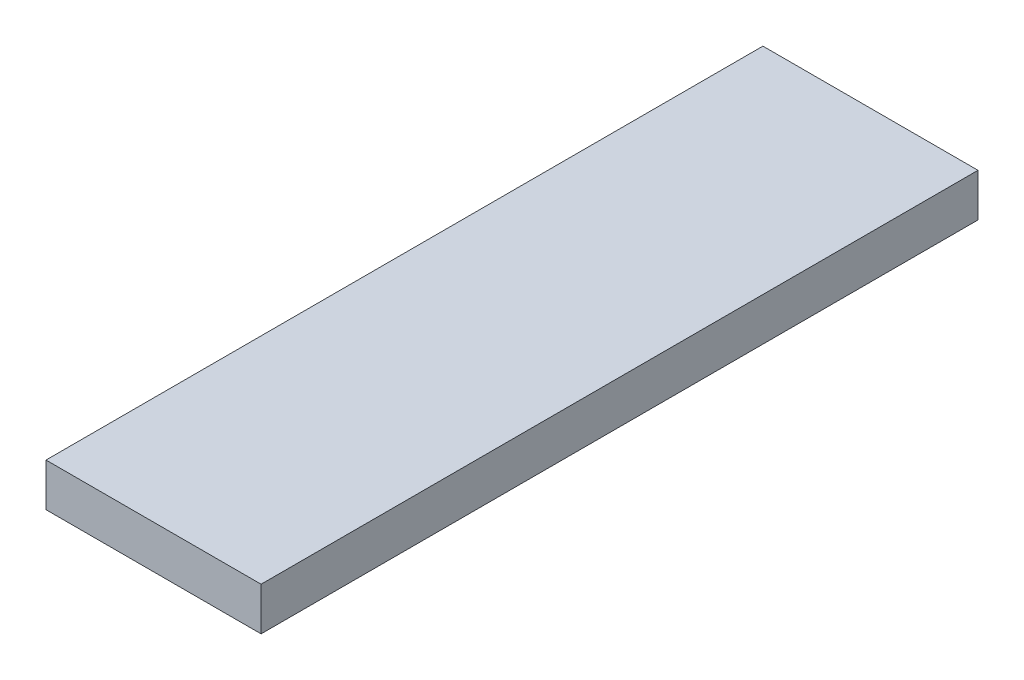
ISO-10303-21;
HEADER;
FILE_DESCRIPTION(('STEP AP214'),'2;1');
FILE_NAME('part.step','',(''),(''),'','','');
FILE_SCHEMA(('AUTOMOTIVE_DESIGN { 1 0 10303 214 1 1 1 1 }'));
ENDSEC;
DATA;
#1=APPLICATION_CONTEXT('core data for automotive mechanical design processes');
#2=APPLICATION_PROTOCOL_DEFINITION('international standard','automotive_design',2000,#1);
#3=PRODUCT_CONTEXT('',#1,'mechanical');
#4=PRODUCT('Part','Part','',(#3));
#5=PRODUCT_RELATED_PRODUCT_CATEGORY('part','',(#4));
#6=PRODUCT_DEFINITION_FORMATION('','',#4);
#7=PRODUCT_DEFINITION_CONTEXT('part definition',#1,'design');
#8=PRODUCT_DEFINITION('design','',#6,#7);
#9=PRODUCT_DEFINITION_SHAPE('','',#8);
#10=(LENGTH_UNIT() NAMED_UNIT(*) SI_UNIT(.MILLI.,.METRE.));
#11=(NAMED_UNIT(*) PLANE_ANGLE_UNIT() SI_UNIT($,.RADIAN.));
#12=(NAMED_UNIT(*) SI_UNIT($,.STERADIAN.) SOLID_ANGLE_UNIT());
#13=UNCERTAINTY_MEASURE_WITH_UNIT(LENGTH_MEASURE(1.E-05),#10,'distance_accuracy_value','');
#14=(GEOMETRIC_REPRESENTATION_CONTEXT(3) GLOBAL_UNCERTAINTY_ASSIGNED_CONTEXT((#13)) GLOBAL_UNIT_ASSIGNED_CONTEXT((#10,
#11,#12)) REPRESENTATION_CONTEXT('',''));
#15=CARTESIAN_POINT('',(0.,0.,0.));
#16=DIRECTION('',(0.,0.,1.));
#17=DIRECTION('',(1.,0.,0.));
#18=AXIS2_PLACEMENT_3D('',#15,#16,#17);
#19=CARTESIAN_POINT('',(0.,0.,635.));
#20=DIRECTION('',(1.,0.,0.));
#21=DIRECTION('',(0.,0.,-1.));
#22=AXIS2_PLACEMENT_3D('',#19,#20,#21);
#23=PLANE('',#22);
#24=DIRECTION('',(0.,-1.,0.));
#25=VECTOR('',#24,1.);
#26=CARTESIAN_POINT('',(0.,0.,0.));
#27=LINE('',#26,#25);
#28=CARTESIAN_POINT('',(0.,38.1,0.));
#29=VERTEX_POINT('',#28);
#30=CARTESIAN_POINT('',(0.,0.,0.));
#31=VERTEX_POINT('',#30);
#32=EDGE_CURVE('E96',#29,#31,#27,.T.);
#33=ORIENTED_EDGE('',*,*,#32,.T.);
#34=DIRECTION('',(0.,0.,-1.));
#35=VECTOR('',#34,1.);
#36=CARTESIAN_POINT('',(0.,0.,635.));
#37=LINE('',#36,#35);
#38=CARTESIAN_POINT('',(0.,0.,635.));
#39=VERTEX_POINT('',#38);
#40=EDGE_CURVE('E11',#39,#31,#37,.T.);
#41=ORIENTED_EDGE('',*,*,#40,.F.);
#42=DIRECTION('',(0.,-1.,0.));
#43=VECTOR('',#42,1.);
#44=CARTESIAN_POINT('',(0.,0.,635.));
#45=LINE('',#44,#43);
#46=CARTESIAN_POINT('',(0.,38.1,635.));
#47=VERTEX_POINT('',#46);
#48=EDGE_CURVE('E84',#47,#39,#45,.T.);
#49=ORIENTED_EDGE('',*,*,#48,.F.);
#50=DIRECTION('',(0.,0.,-1.));
#51=VECTOR('',#50,1.);
#52=CARTESIAN_POINT('',(0.,38.1,635.));
#53=LINE('',#52,#51);
#54=EDGE_CURVE('E92',#47,#29,#53,.T.);
#55=ORIENTED_EDGE('',*,*,#54,.T.);
#56=EDGE_LOOP('',(#33,#41,#49,#55));
#57=FACE_BOUND('',#56,.T.);
#58=ADVANCED_FACE('F33',(#57),#23,.F.);
#59=CARTESIAN_POINT('',(0.,0.,635.));
#60=DIRECTION('',(0.,1.,0.));
#61=DIRECTION('',(0.,0.,1.));
#62=AXIS2_PLACEMENT_3D('',#59,#60,#61);
#63=PLANE('',#62);
#64=DIRECTION('',(1.,0.,0.));
#65=VECTOR('',#64,1.);
#66=CARTESIAN_POINT('',(0.,0.,0.));
#67=LINE('',#66,#65);
#68=CARTESIAN_POINT('',(190.5,0.,0.));
#69=VERTEX_POINT('',#68);
#70=EDGE_CURVE('E88',#31,#69,#67,.T.);
#71=ORIENTED_EDGE('',*,*,#70,.T.);
#72=DIRECTION('',(0.,0.,-1.));
#73=VECTOR('',#72,1.);
#74=CARTESIAN_POINT('',(190.5,0.,635.));
#75=LINE('',#74,#73);
#76=CARTESIAN_POINT('',(190.5,0.,635.));
#77=VERTEX_POINT('',#76);
#78=EDGE_CURVE('E41',#77,#69,#75,.T.);
#79=ORIENTED_EDGE('',*,*,#78,.F.);
#80=DIRECTION('',(1.,0.,0.));
#81=VECTOR('',#80,1.);
#82=CARTESIAN_POINT('',(0.,0.,635.));
#83=LINE('',#82,#81);
#84=EDGE_CURVE('E79',#39,#77,#83,.T.);
#85=ORIENTED_EDGE('',*,*,#84,.F.);
#86=ORIENTED_EDGE('',*,*,#40,.T.);
#87=EDGE_LOOP('',(#71,#79,#85,#86));
#88=FACE_BOUND('',#87,.T.);
#89=ADVANCED_FACE('F87',(#88),#63,.F.);
#90=CARTESIAN_POINT('',(190.5,0.,635.));
#91=DIRECTION('',(-1.,0.,0.));
#92=DIRECTION('',(0.,0.,1.));
#93=AXIS2_PLACEMENT_3D('',#90,#91,#92);
#94=PLANE('',#93);
#95=DIRECTION('',(0.,1.,0.));
#96=VECTOR('',#95,1.);
#97=CARTESIAN_POINT('',(190.5,0.,0.));
#98=LINE('',#97,#96);
#99=CARTESIAN_POINT('',(190.5,38.1,0.));
#100=VERTEX_POINT('',#99);
#101=EDGE_CURVE('E66',#69,#100,#98,.T.);
#102=ORIENTED_EDGE('',*,*,#101,.T.);
#103=DIRECTION('',(0.,0.,-1.));
#104=VECTOR('',#103,1.);
#105=CARTESIAN_POINT('',(190.5,38.1,635.));
#106=LINE('',#105,#104);
#107=CARTESIAN_POINT('',(190.5,38.1,635.));
#108=VERTEX_POINT('',#107);
#109=EDGE_CURVE('E89',#108,#100,#106,.T.);
#110=ORIENTED_EDGE('',*,*,#109,.F.);
#111=DIRECTION('',(0.,1.,0.));
#112=VECTOR('',#111,1.);
#113=CARTESIAN_POINT('',(190.5,0.,635.));
#114=LINE('',#113,#112);
#115=EDGE_CURVE('E82',#77,#108,#114,.T.);
#116=ORIENTED_EDGE('',*,*,#115,.F.);
#117=ORIENTED_EDGE('',*,*,#78,.T.);
#118=EDGE_LOOP('',(#102,#110,#116,#117));
#119=FACE_BOUND('',#118,.T.);
#120=ADVANCED_FACE('F90',(#119),#94,.F.);
#121=CARTESIAN_POINT('',(0.,38.1,635.));
#122=DIRECTION('',(0.,-1.,0.));
#123=DIRECTION('',(0.,0.,-1.));
#124=AXIS2_PLACEMENT_3D('',#121,#122,#123);
#125=PLANE('',#124);
#126=DIRECTION('',(-1.,0.,0.));
#127=VECTOR('',#126,1.);
#128=CARTESIAN_POINT('',(0.,38.1,0.));
#129=LINE('',#128,#127);
#130=EDGE_CURVE('E72',#100,#29,#129,.T.);
#131=ORIENTED_EDGE('',*,*,#130,.T.);
#132=ORIENTED_EDGE('',*,*,#54,.F.);
#133=DIRECTION('',(-1.,0.,0.));
#134=VECTOR('',#133,1.);
#135=CARTESIAN_POINT('',(0.,38.1,635.));
#136=LINE('',#135,#134);
#137=EDGE_CURVE('E49',#108,#47,#136,.T.);
#138=ORIENTED_EDGE('',*,*,#137,.F.);
#139=ORIENTED_EDGE('',*,*,#109,.T.);
#140=EDGE_LOOP('',(#131,#132,#138,#139));
#141=FACE_BOUND('',#140,.T.);
#142=ADVANCED_FACE('F103',(#141),#125,.F.);
#143=CARTESIAN_POINT('',(0.,0.,635.));
#144=DIRECTION('',(0.,0.,-1.));
#145=DIRECTION('',(-1.,0.,0.));
#146=AXIS2_PLACEMENT_3D('',#143,#144,#145);
#147=PLANE('',#146);
#148=ORIENTED_EDGE('',*,*,#48,.T.);
#149=ORIENTED_EDGE('',*,*,#84,.T.);
#150=ORIENTED_EDGE('',*,*,#115,.T.);
#151=ORIENTED_EDGE('',*,*,#137,.T.);
#152=EDGE_LOOP('',(#148,#149,#150,#151));
#153=FACE_BOUND('',#152,.T.);
#154=ADVANCED_FACE('F80',(#153),#147,.F.);
#155=CARTESIAN_POINT('',(0.,0.,0.));
#156=DIRECTION('',(0.,0.,-1.));
#157=DIRECTION('',(-1.,0.,0.));
#158=AXIS2_PLACEMENT_3D('',#155,#156,#157);
#159=PLANE('',#158);
#160=ORIENTED_EDGE('',*,*,#32,.F.);
#161=ORIENTED_EDGE('',*,*,#130,.F.);
#162=ORIENTED_EDGE('',*,*,#101,.F.);
#163=ORIENTED_EDGE('',*,*,#70,.F.);
#164=EDGE_LOOP('',(#160,#161,#162,#163));
#165=FACE_BOUND('',#164,.T.);
#166=ADVANCED_FACE('F106',(#165),#159,.T.);
#167=CLOSED_SHELL('',(#58,#89,#120,#142,#154,#166));
#168=MANIFOLD_SOLID_BREP('B2',#167);
#169=ADVANCED_BREP_SHAPE_REPRESENTATION('',(#18,#168),#14);
#170=SHAPE_DEFINITION_REPRESENTATION(#9,#169);
ENDSEC;
END-ISO-10303-21;
